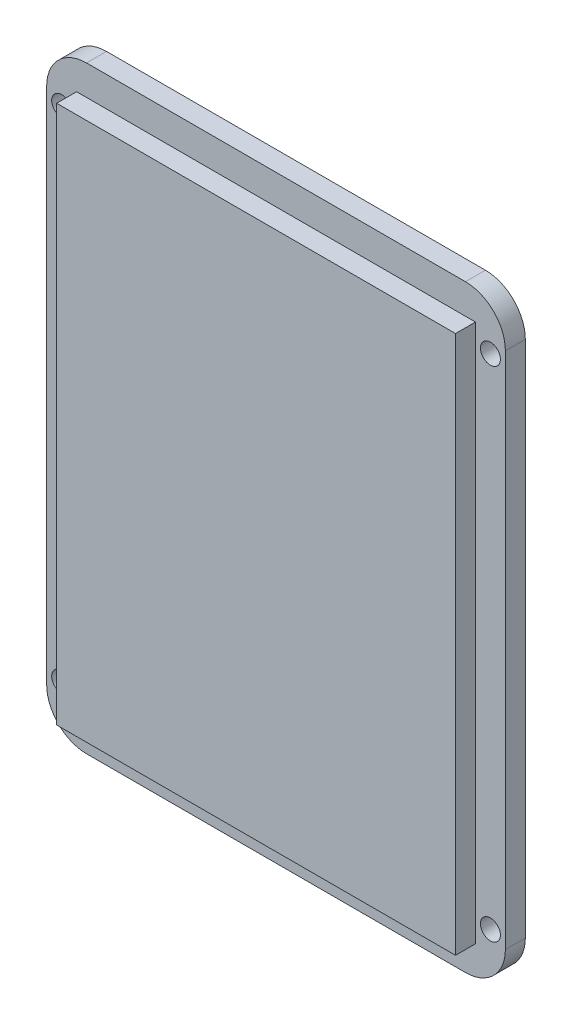
ISO-10303-21;
HEADER;
FILE_DESCRIPTION(('STEP AP214'),'2;1');
FILE_NAME('part.step','',(''),(''),'','','');
FILE_SCHEMA(('AUTOMOTIVE_DESIGN { 1 0 10303 214 1 1 1 1 }'));
ENDSEC;
DATA;
#1=APPLICATION_CONTEXT('core data for automotive mechanical design processes');
#2=APPLICATION_PROTOCOL_DEFINITION('international standard','automotive_design',2000,#1);
#3=PRODUCT_CONTEXT('',#1,'mechanical');
#4=PRODUCT('Part','Part','',(#3));
#5=PRODUCT_RELATED_PRODUCT_CATEGORY('part','',(#4));
#6=PRODUCT_DEFINITION_FORMATION('','',#4);
#7=PRODUCT_DEFINITION_CONTEXT('part definition',#1,'design');
#8=PRODUCT_DEFINITION('design','',#6,#7);
#9=PRODUCT_DEFINITION_SHAPE('','',#8);
#10=(LENGTH_UNIT() NAMED_UNIT(*) SI_UNIT(.MILLI.,.METRE.));
#11=(NAMED_UNIT(*) PLANE_ANGLE_UNIT() SI_UNIT($,.RADIAN.));
#12=(NAMED_UNIT(*) SI_UNIT($,.STERADIAN.) SOLID_ANGLE_UNIT());
#13=UNCERTAINTY_MEASURE_WITH_UNIT(LENGTH_MEASURE(1.E-05),#10,'distance_accuracy_value','');
#14=(GEOMETRIC_REPRESENTATION_CONTEXT(3) GLOBAL_UNCERTAINTY_ASSIGNED_CONTEXT((#13)) GLOBAL_UNIT_ASSIGNED_CONTEXT((#10,
#11,#12)) REPRESENTATION_CONTEXT('',''));
#15=CARTESIAN_POINT('',(0.,0.,0.));
#16=DIRECTION('',(0.,0.,1.));
#17=DIRECTION('',(1.,0.,0.));
#18=AXIS2_PLACEMENT_3D('',#15,#16,#17);
#19=CARTESIAN_POINT('',(43.,0.,4.));
#20=DIRECTION('',(1.,0.,0.));
#21=DIRECTION('',(0.,1.,0.));
#22=AXIS2_PLACEMENT_3D('',#19,#20,#21);
#23=PLANE('',#22);
#24=DIRECTION('',(0.,-1.,0.));
#25=VECTOR('',#24,1.);
#26=CARTESIAN_POINT('',(43.,0.,2.));
#27=LINE('',#26,#25);
#28=CARTESIAN_POINT('',(43.,57.,2.));
#29=VERTEX_POINT('',#28);
#30=CARTESIAN_POINT('',(43.,3.,2.));
#31=VERTEX_POINT('',#30);
#32=EDGE_CURVE('E130',#29,#31,#27,.T.);
#33=ORIENTED_EDGE('',*,*,#32,.F.);
#34=DIRECTION('',(0.,0.,-1.));
#35=VECTOR('',#34,1.);
#36=CARTESIAN_POINT('',(43.,57.,4.));
#37=LINE('',#36,#35);
#38=CARTESIAN_POINT('',(43.,57.,4.));
#39=VERTEX_POINT('',#38);
#40=EDGE_CURVE('E136',#39,#29,#37,.T.);
#41=ORIENTED_EDGE('',*,*,#40,.F.);
#42=DIRECTION('',(0.,-1.,0.));
#43=VECTOR('',#42,1.);
#44=CARTESIAN_POINT('',(43.,0.,4.));
#45=LINE('',#44,#43);
#46=CARTESIAN_POINT('',(43.,3.,4.));
#47=VERTEX_POINT('',#46);
#48=EDGE_CURVE('E214',#39,#47,#45,.T.);
#49=ORIENTED_EDGE('',*,*,#48,.T.);
#50=DIRECTION('',(0.,0.,-1.));
#51=VECTOR('',#50,1.);
#52=CARTESIAN_POINT('',(43.,3.,4.));
#53=LINE('',#52,#51);
#54=EDGE_CURVE('E151',#47,#31,#53,.T.);
#55=ORIENTED_EDGE('',*,*,#54,.T.);
#56=EDGE_LOOP('',(#33,#41,#49,#55));
#57=FACE_BOUND('',#56,.T.);
#58=ADVANCED_FACE('F35',(#57),#23,.T.);
#59=CARTESIAN_POINT('',(0.,57.,4.));
#60=DIRECTION('',(0.,1.,0.));
#61=DIRECTION('',(0.,0.,1.));
#62=AXIS2_PLACEMENT_3D('',#59,#60,#61);
#63=PLANE('',#62);
#64=DIRECTION('',(1.,0.,0.));
#65=VECTOR('',#64,1.);
#66=CARTESIAN_POINT('',(0.,57.,2.));
#67=LINE('',#66,#65);
#68=CARTESIAN_POINT('',(3.00000000000001,57.,2.));
#69=VERTEX_POINT('',#68);
#70=EDGE_CURVE('E146',#69,#29,#67,.T.);
#71=ORIENTED_EDGE('',*,*,#70,.F.);
#72=DIRECTION('',(0.,0.,-1.));
#73=VECTOR('',#72,1.);
#74=CARTESIAN_POINT('',(3.00000000000001,57.,4.));
#75=LINE('',#74,#73);
#76=CARTESIAN_POINT('',(3.00000000000001,57.,4.));
#77=VERTEX_POINT('',#76);
#78=EDGE_CURVE('E145',#77,#69,#75,.T.);
#79=ORIENTED_EDGE('',*,*,#78,.F.);
#80=DIRECTION('',(1.,0.,0.));
#81=VECTOR('',#80,1.);
#82=CARTESIAN_POINT('',(0.,57.,4.));
#83=LINE('',#82,#81);
#84=EDGE_CURVE('E217',#77,#39,#83,.T.);
#85=ORIENTED_EDGE('',*,*,#84,.T.);
#86=ORIENTED_EDGE('',*,*,#40,.T.);
#87=EDGE_LOOP('',(#71,#79,#85,#86));
#88=FACE_BOUND('',#87,.T.);
#89=ADVANCED_FACE('F227',(#88),#63,.T.);
#90=CARTESIAN_POINT('',(3.00000000000001,0.,4.));
#91=DIRECTION('',(1.,0.,0.));
#92=DIRECTION('',(0.,1.,0.));
#93=AXIS2_PLACEMENT_3D('',#90,#91,#92);
#94=PLANE('',#93);
#95=ORIENTED_EDGE('',*,*,#78,.T.);
#96=DIRECTION('',(0.,-1.,0.));
#97=VECTOR('',#96,1.);
#98=CARTESIAN_POINT('',(3.00000000000001,0.,2.));
#99=LINE('',#98,#97);
#100=CARTESIAN_POINT('',(3.00000000000001,3.,2.));
#101=VERTEX_POINT('',#100);
#102=EDGE_CURVE('E127',#69,#101,#99,.T.);
#103=ORIENTED_EDGE('',*,*,#102,.T.);
#104=DIRECTION('',(0.,0.,-1.));
#105=VECTOR('',#104,1.);
#106=CARTESIAN_POINT('',(3.00000000000001,3.,4.));
#107=LINE('',#106,#105);
#108=CARTESIAN_POINT('',(3.00000000000001,3.,4.));
#109=VERTEX_POINT('',#108);
#110=EDGE_CURVE('E143',#109,#101,#107,.T.);
#111=ORIENTED_EDGE('',*,*,#110,.F.);
#112=DIRECTION('',(0.,-1.,0.));
#113=VECTOR('',#112,1.);
#114=CARTESIAN_POINT('',(3.00000000000001,0.,4.));
#115=LINE('',#114,#113);
#116=EDGE_CURVE('E220',#77,#109,#115,.T.);
#117=ORIENTED_EDGE('',*,*,#116,.F.);
#118=EDGE_LOOP('',(#95,#103,#111,#117));
#119=FACE_BOUND('',#118,.T.);
#120=ADVANCED_FACE('F141',(#119),#94,.F.);
#121=CARTESIAN_POINT('',(0.,3.,4.));
#122=DIRECTION('',(0.,1.,0.));
#123=DIRECTION('',(0.,0.,1.));
#124=AXIS2_PLACEMENT_3D('',#121,#122,#123);
#125=PLANE('',#124);
#126=ORIENTED_EDGE('',*,*,#110,.T.);
#127=DIRECTION('',(1.,0.,0.));
#128=VECTOR('',#127,1.);
#129=CARTESIAN_POINT('',(0.,3.,2.));
#130=LINE('',#129,#128);
#131=EDGE_CURVE('E124',#101,#31,#130,.T.);
#132=ORIENTED_EDGE('',*,*,#131,.T.);
#133=ORIENTED_EDGE('',*,*,#54,.F.);
#134=DIRECTION('',(1.,0.,0.));
#135=VECTOR('',#134,1.);
#136=CARTESIAN_POINT('',(0.,3.,4.));
#137=LINE('',#136,#135);
#138=EDGE_CURVE('E150',#109,#47,#137,.T.);
#139=ORIENTED_EDGE('',*,*,#138,.F.);
#140=EDGE_LOOP('',(#126,#132,#133,#139));
#141=FACE_BOUND('',#140,.T.);
#142=ADVANCED_FACE('F149',(#141),#125,.F.);
#143=CARTESIAN_POINT('',(0.,0.,4.));
#144=DIRECTION('',(0.,0.,1.));
#145=DIRECTION('',(1.,0.,0.));
#146=AXIS2_PLACEMENT_3D('',#143,#144,#145);
#147=PLANE('',#146);
#148=ORIENTED_EDGE('',*,*,#48,.F.);
#149=ORIENTED_EDGE('',*,*,#84,.F.);
#150=ORIENTED_EDGE('',*,*,#116,.T.);
#151=ORIENTED_EDGE('',*,*,#138,.T.);
#152=EDGE_LOOP('',(#148,#149,#150,#151));
#153=FACE_BOUND('',#152,.T.);
#154=ADVANCED_FACE('F223',(#153),#147,.T.);
#155=CARTESIAN_POINT('',(0.,60.,2.));
#156=DIRECTION('',(1.,0.,0.));
#157=DIRECTION('',(0.,1.,0.));
#158=AXIS2_PLACEMENT_3D('',#155,#156,#157);
#159=PLANE('',#158);
#160=DIRECTION('',(0.,-1.,0.));
#161=VECTOR('',#160,1.);
#162=CARTESIAN_POINT('',(0.,60.,0.));
#163=LINE('',#162,#161);
#164=CARTESIAN_POINT('',(0.,56.,0.));
#165=VERTEX_POINT('',#164);
#166=CARTESIAN_POINT('',(0.,4.00000000000001,0.));
#167=VERTEX_POINT('',#166);
#168=EDGE_CURVE('E208',#165,#167,#163,.T.);
#169=ORIENTED_EDGE('',*,*,#168,.T.);
#170=DIRECTION('',(0.,0.,-1.));
#171=VECTOR('',#170,1.);
#172=CARTESIAN_POINT('',(0.,4.,2.));
#173=LINE('',#172,#171);
#174=CARTESIAN_POINT('',(0.,4.00000000000001,2.));
#175=VERTEX_POINT('',#174);
#176=EDGE_CURVE('E174',#167,#175,#173,.F.);
#177=ORIENTED_EDGE('',*,*,#176,.T.);
#178=DIRECTION('',(0.,-1.,0.));
#179=VECTOR('',#178,1.);
#180=CARTESIAN_POINT('',(0.,60.,2.));
#181=LINE('',#180,#179);
#182=CARTESIAN_POINT('',(0.,56.,2.));
#183=VERTEX_POINT('',#182);
#184=EDGE_CURVE('E206',#183,#175,#181,.T.);
#185=ORIENTED_EDGE('',*,*,#184,.F.);
#186=DIRECTION('',(0.,0.,-1.));
#187=VECTOR('',#186,1.);
#188=CARTESIAN_POINT('',(0.,56.,2.));
#189=LINE('',#188,#187);
#190=EDGE_CURVE('E171',#183,#165,#189,.T.);
#191=ORIENTED_EDGE('',*,*,#190,.T.);
#192=EDGE_LOOP('',(#169,#177,#185,#191));
#193=FACE_BOUND('',#192,.T.);
#194=ADVANCED_FACE('F260',(#193),#159,.F.);
#195=CARTESIAN_POINT('',(0.,0.,2.));
#196=DIRECTION('',(0.,1.,0.));
#197=DIRECTION('',(-1.,0.,0.));
#198=AXIS2_PLACEMENT_3D('',#195,#196,#197);
#199=PLANE('',#198);
#200=DIRECTION('',(1.,0.,0.));
#201=VECTOR('',#200,1.);
#202=CARTESIAN_POINT('',(0.,0.,2.));
#203=LINE('',#202,#201);
#204=CARTESIAN_POINT('',(4.00000000000001,0.,2.));
#205=VERTEX_POINT('',#204);
#206=CARTESIAN_POINT('',(42.,0.,2.));
#207=VERTEX_POINT('',#206);
#208=EDGE_CURVE('E264',#205,#207,#203,.T.);
#209=ORIENTED_EDGE('',*,*,#208,.F.);
#210=DIRECTION('',(0.,0.,-1.));
#211=VECTOR('',#210,1.);
#212=CARTESIAN_POINT('',(4.00000000000001,0.,2.));
#213=LINE('',#212,#211);
#214=CARTESIAN_POINT('',(4.00000000000001,0.,0.));
#215=VERTEX_POINT('',#214);
#216=EDGE_CURVE('E160',#205,#215,#213,.T.);
#217=ORIENTED_EDGE('',*,*,#216,.T.);
#218=DIRECTION('',(1.,0.,0.));
#219=VECTOR('',#218,1.);
#220=CARTESIAN_POINT('',(0.,0.,0.));
#221=LINE('',#220,#219);
#222=CARTESIAN_POINT('',(42.,0.,0.));
#223=VERTEX_POINT('',#222);
#224=EDGE_CURVE('E204',#215,#223,#221,.T.);
#225=ORIENTED_EDGE('',*,*,#224,.T.);
#226=DIRECTION('',(0.,0.,-1.));
#227=VECTOR('',#226,1.);
#228=CARTESIAN_POINT('',(42.,0.,2.));
#229=LINE('',#228,#227);
#230=EDGE_CURVE('E135',#223,#207,#229,.F.);
#231=ORIENTED_EDGE('',*,*,#230,.T.);
#232=EDGE_LOOP('',(#209,#217,#225,#231));
#233=FACE_BOUND('',#232,.T.);
#234=ADVANCED_FACE('F328',(#233),#199,.F.);
#235=CARTESIAN_POINT('',(46.,60.,2.));
#236=DIRECTION('',(-1.,0.,0.));
#237=DIRECTION('',(0.,-1.,0.));
#238=AXIS2_PLACEMENT_3D('',#235,#236,#237);
#239=PLANE('',#238);
#240=DIRECTION('',(0.,1.,0.));
#241=VECTOR('',#240,1.);
#242=CARTESIAN_POINT('',(46.,60.,2.));
#243=LINE('',#242,#241);
#244=CARTESIAN_POINT('',(46.,4.00000000000001,2.));
#245=VERTEX_POINT('',#244);
#246=CARTESIAN_POINT('',(46.,56.,2.));
#247=VERTEX_POINT('',#246);
#248=EDGE_CURVE('E195',#245,#247,#243,.T.);
#249=ORIENTED_EDGE('',*,*,#248,.F.);
#250=DIRECTION('',(0.,0.,-1.));
#251=VECTOR('',#250,1.);
#252=CARTESIAN_POINT('',(46.,4.,2.));
#253=LINE('',#252,#251);
#254=CARTESIAN_POINT('',(46.,4.00000000000001,0.));
#255=VERTEX_POINT('',#254);
#256=EDGE_CURVE('E185',#245,#255,#253,.T.);
#257=ORIENTED_EDGE('',*,*,#256,.T.);
#258=DIRECTION('',(0.,1.,0.));
#259=VECTOR('',#258,1.);
#260=CARTESIAN_POINT('',(46.,60.,0.));
#261=LINE('',#260,#259);
#262=CARTESIAN_POINT('',(46.,56.,0.));
#263=VERTEX_POINT('',#262);
#264=EDGE_CURVE('E193',#255,#263,#261,.T.);
#265=ORIENTED_EDGE('',*,*,#264,.T.);
#266=DIRECTION('',(0.,0.,-1.));
#267=VECTOR('',#266,1.);
#268=CARTESIAN_POINT('',(46.,56.,2.));
#269=LINE('',#268,#267);
#270=EDGE_CURVE('E183',#263,#247,#269,.F.);
#271=ORIENTED_EDGE('',*,*,#270,.T.);
#272=EDGE_LOOP('',(#249,#257,#265,#271));
#273=FACE_BOUND('',#272,.T.);
#274=ADVANCED_FACE('F192',(#273),#239,.F.);
#275=CARTESIAN_POINT('',(0.,60.,2.));
#276=DIRECTION('',(0.,-1.,0.));
#277=DIRECTION('',(0.,0.,-1.));
#278=AXIS2_PLACEMENT_3D('',#275,#276,#277);
#279=PLANE('',#278);
#280=DIRECTION('',(-1.,0.,0.));
#281=VECTOR('',#280,1.);
#282=CARTESIAN_POINT('',(0.,60.,2.));
#283=LINE('',#282,#281);
#284=CARTESIAN_POINT('',(42.,60.,2.));
#285=VERTEX_POINT('',#284);
#286=CARTESIAN_POINT('',(4.00000000000001,60.,2.));
#287=VERTEX_POINT('',#286);
#288=EDGE_CURVE('E147',#285,#287,#283,.T.);
#289=ORIENTED_EDGE('',*,*,#288,.F.);
#290=DIRECTION('',(0.,0.,-1.));
#291=VECTOR('',#290,1.);
#292=CARTESIAN_POINT('',(42.,60.,2.));
#293=LINE('',#292,#291);
#294=CARTESIAN_POINT('',(42.,60.,0.));
#295=VERTEX_POINT('',#294);
#296=EDGE_CURVE('E11',#285,#295,#293,.T.);
#297=ORIENTED_EDGE('',*,*,#296,.T.);
#298=DIRECTION('',(-1.,0.,0.));
#299=VECTOR('',#298,1.);
#300=CARTESIAN_POINT('',(0.,60.,0.));
#301=LINE('',#300,#299);
#302=CARTESIAN_POINT('',(4.00000000000001,60.,0.));
#303=VERTEX_POINT('',#302);
#304=EDGE_CURVE('E203',#295,#303,#301,.T.);
#305=ORIENTED_EDGE('',*,*,#304,.T.);
#306=DIRECTION('',(0.,0.,-1.));
#307=VECTOR('',#306,1.);
#308=CARTESIAN_POINT('',(4.00000000000001,60.,2.));
#309=LINE('',#308,#307);
#310=EDGE_CURVE('E43',#303,#287,#309,.F.);
#311=ORIENTED_EDGE('',*,*,#310,.T.);
#312=EDGE_LOOP('',(#289,#297,#305,#311));
#313=FACE_BOUND('',#312,.T.);
#314=ADVANCED_FACE('F253',(#313),#279,.F.);
#315=CARTESIAN_POINT('',(0.,0.,2.));
#316=DIRECTION('',(0.,0.,1.));
#317=DIRECTION('',(1.,0.,0.));
#318=AXIS2_PLACEMENT_3D('',#315,#316,#317);
#319=PLANE('',#318);
#320=CARTESIAN_POINT('',(1.5,5.,2.));
#321=DIRECTION('',(0.,0.,1.));
#322=DIRECTION('',(1.,0.,0.));
#323=AXIS2_PLACEMENT_3D('',#320,#321,#322);
#324=CIRCLE('',#323,1.);
#325=CARTESIAN_POINT('',(2.5,5.,2.));
#326=VERTEX_POINT('',#325);
#327=EDGE_CURVE('E278',#326,#326,#324,.F.);
#328=ORIENTED_EDGE('',*,*,#327,.T.);
#329=EDGE_LOOP('',(#328));
#330=FACE_BOUND('',#329,.T.);
#331=CARTESIAN_POINT('',(1.50000000000001,55.,2.));
#332=DIRECTION('',(0.,0.,1.));
#333=DIRECTION('',(1.,0.,0.));
#334=AXIS2_PLACEMENT_3D('',#331,#332,#333);
#335=CIRCLE('',#334,1.);
#336=CARTESIAN_POINT('',(2.50000000000001,55.,2.));
#337=VERTEX_POINT('',#336);
#338=EDGE_CURVE('E282',#337,#337,#335,.F.);
#339=ORIENTED_EDGE('',*,*,#338,.T.);
#340=EDGE_LOOP('',(#339));
#341=FACE_BOUND('',#340,.T.);
#342=CARTESIAN_POINT('',(44.5,55.,2.));
#343=DIRECTION('',(0.,0.,1.));
#344=DIRECTION('',(1.,0.,0.));
#345=AXIS2_PLACEMENT_3D('',#342,#343,#344);
#346=CIRCLE('',#345,0.999999999999998);
#347=CARTESIAN_POINT('',(45.5,55.,2.));
#348=VERTEX_POINT('',#347);
#349=EDGE_CURVE('E287',#348,#348,#346,.F.);
#350=ORIENTED_EDGE('',*,*,#349,.T.);
#351=EDGE_LOOP('',(#350));
#352=FACE_BOUND('',#351,.T.);
#353=CARTESIAN_POINT('',(44.5,5.,2.));
#354=DIRECTION('',(0.,0.,1.));
#355=DIRECTION('',(1.,0.,0.));
#356=AXIS2_PLACEMENT_3D('',#353,#354,#355);
#357=CIRCLE('',#356,0.999999999999998);
#358=CARTESIAN_POINT('',(45.5,5.,2.));
#359=VERTEX_POINT('',#358);
#360=EDGE_CURVE('E269',#359,#359,#357,.F.);
#361=ORIENTED_EDGE('',*,*,#360,.T.);
#362=EDGE_LOOP('',(#361));
#363=FACE_BOUND('',#362,.T.);
#364=ORIENTED_EDGE('',*,*,#70,.T.);
#365=ORIENTED_EDGE('',*,*,#32,.T.);
#366=ORIENTED_EDGE('',*,*,#131,.F.);
#367=ORIENTED_EDGE('',*,*,#102,.F.);
#368=EDGE_LOOP('',(#364,#365,#366,#367));
#369=FACE_BOUND('',#368,.T.);
#370=ORIENTED_EDGE('',*,*,#184,.T.);
#371=CARTESIAN_POINT('',(4.00000000000001,4.,2.));
#372=DIRECTION('',(0.,0.,1.));
#373=DIRECTION('',(1.,0.,0.));
#374=AXIS2_PLACEMENT_3D('',#371,#372,#373);
#375=CIRCLE('',#374,4.);
#376=EDGE_CURVE('E181',#175,#205,#375,.T.);
#377=ORIENTED_EDGE('',*,*,#376,.T.);
#378=ORIENTED_EDGE('',*,*,#208,.T.);
#379=CARTESIAN_POINT('',(42.,4.,2.));
#380=DIRECTION('',(0.,0.,1.));
#381=DIRECTION('',(1.,0.,0.));
#382=AXIS2_PLACEMENT_3D('',#379,#380,#381);
#383=CIRCLE('',#382,4.);
#384=EDGE_CURVE('E179',#207,#245,#383,.T.);
#385=ORIENTED_EDGE('',*,*,#384,.T.);
#386=ORIENTED_EDGE('',*,*,#248,.T.);
#387=CARTESIAN_POINT('',(42.,56.,2.));
#388=DIRECTION('',(0.,0.,1.));
#389=DIRECTION('',(1.,0.,0.));
#390=AXIS2_PLACEMENT_3D('',#387,#388,#389);
#391=CIRCLE('',#390,4.);
#392=EDGE_CURVE('E56',#247,#285,#391,.T.);
#393=ORIENTED_EDGE('',*,*,#392,.T.);
#394=ORIENTED_EDGE('',*,*,#288,.T.);
#395=CARTESIAN_POINT('',(4.00000000000001,56.,2.));
#396=DIRECTION('',(0.,0.,1.));
#397=DIRECTION('',(1.,0.,0.));
#398=AXIS2_PLACEMENT_3D('',#395,#396,#397);
#399=CIRCLE('',#398,4.);
#400=EDGE_CURVE('E176',#287,#183,#399,.T.);
#401=ORIENTED_EDGE('',*,*,#400,.T.);
#402=EDGE_LOOP('',(#370,#377,#378,#385,#386,#393,#394,#401));
#403=FACE_BOUND('',#402,.T.);
#404=ADVANCED_FACE('F126',(#330,#341,#352,#363,#369,#403),#319,.T.);
#405=CARTESIAN_POINT('',(0.,0.,0.));
#406=DIRECTION('',(0.,0.,1.));
#407=DIRECTION('',(1.,0.,0.));
#408=AXIS2_PLACEMENT_3D('',#405,#406,#407);
#409=PLANE('',#408);
#410=CARTESIAN_POINT('',(1.5,5.,0.));
#411=DIRECTION('',(0.,0.,1.));
#412=DIRECTION('',(1.,0.,0.));
#413=AXIS2_PLACEMENT_3D('',#410,#411,#412);
#414=CIRCLE('',#413,1.);
#415=CARTESIAN_POINT('',(2.5,5.,0.));
#416=VERTEX_POINT('',#415);
#417=EDGE_CURVE('E290',#416,#416,#414,.T.);
#418=ORIENTED_EDGE('',*,*,#417,.T.);
#419=EDGE_LOOP('',(#418));
#420=FACE_BOUND('',#419,.T.);
#421=CARTESIAN_POINT('',(1.50000000000001,55.,0.));
#422=DIRECTION('',(0.,0.,1.));
#423=DIRECTION('',(1.,0.,0.));
#424=AXIS2_PLACEMENT_3D('',#421,#422,#423);
#425=CIRCLE('',#424,1.);
#426=CARTESIAN_POINT('',(2.50000000000001,55.,0.));
#427=VERTEX_POINT('',#426);
#428=EDGE_CURVE('E294',#427,#427,#425,.T.);
#429=ORIENTED_EDGE('',*,*,#428,.T.);
#430=EDGE_LOOP('',(#429));
#431=FACE_BOUND('',#430,.T.);
#432=CARTESIAN_POINT('',(44.5,55.,0.));
#433=DIRECTION('',(0.,0.,1.));
#434=DIRECTION('',(1.,0.,0.));
#435=AXIS2_PLACEMENT_3D('',#432,#433,#434);
#436=CIRCLE('',#435,0.999999999999998);
#437=CARTESIAN_POINT('',(45.5,55.,0.));
#438=VERTEX_POINT('',#437);
#439=EDGE_CURVE('E291',#438,#438,#436,.T.);
#440=ORIENTED_EDGE('',*,*,#439,.T.);
#441=EDGE_LOOP('',(#440));
#442=FACE_BOUND('',#441,.T.);
#443=CARTESIAN_POINT('',(44.5,5.,0.));
#444=DIRECTION('',(0.,0.,1.));
#445=DIRECTION('',(1.,0.,0.));
#446=AXIS2_PLACEMENT_3D('',#443,#444,#445);
#447=CIRCLE('',#446,0.999999999999998);
#448=CARTESIAN_POINT('',(45.5,5.,0.));
#449=VERTEX_POINT('',#448);
#450=EDGE_CURVE('E274',#449,#449,#447,.T.);
#451=ORIENTED_EDGE('',*,*,#450,.T.);
#452=EDGE_LOOP('',(#451));
#453=FACE_BOUND('',#452,.T.);
#454=ORIENTED_EDGE('',*,*,#224,.F.);
#455=CARTESIAN_POINT('',(4.00000000000001,4.,0.));
#456=DIRECTION('',(0.,0.,1.));
#457=DIRECTION('',(1.,0.,0.));
#458=AXIS2_PLACEMENT_3D('',#455,#456,#457);
#459=CIRCLE('',#458,4.);
#460=EDGE_CURVE('E169',#215,#167,#459,.F.);
#461=ORIENTED_EDGE('',*,*,#460,.T.);
#462=ORIENTED_EDGE('',*,*,#168,.F.);
#463=CARTESIAN_POINT('',(4.00000000000001,56.,0.));
#464=DIRECTION('',(0.,0.,1.));
#465=DIRECTION('',(1.,0.,0.));
#466=AXIS2_PLACEMENT_3D('',#463,#464,#465);
#467=CIRCLE('',#466,4.);
#468=EDGE_CURVE('E163',#165,#303,#467,.F.);
#469=ORIENTED_EDGE('',*,*,#468,.T.);
#470=ORIENTED_EDGE('',*,*,#304,.F.);
#471=CARTESIAN_POINT('',(42.,56.,0.));
#472=DIRECTION('',(0.,0.,1.));
#473=DIRECTION('',(1.,0.,0.));
#474=AXIS2_PLACEMENT_3D('',#471,#472,#473);
#475=CIRCLE('',#474,4.);
#476=EDGE_CURVE('E165',#295,#263,#475,.F.);
#477=ORIENTED_EDGE('',*,*,#476,.T.);
#478=ORIENTED_EDGE('',*,*,#264,.F.);
#479=CARTESIAN_POINT('',(42.,4.,0.));
#480=DIRECTION('',(0.,0.,1.));
#481=DIRECTION('',(1.,0.,0.));
#482=AXIS2_PLACEMENT_3D('',#479,#480,#481);
#483=CIRCLE('',#482,4.);
#484=EDGE_CURVE('E167',#255,#223,#483,.F.);
#485=ORIENTED_EDGE('',*,*,#484,.T.);
#486=EDGE_LOOP('',(#454,#461,#462,#469,#470,#477,#478,#485));
#487=FACE_BOUND('',#486,.T.);
#488=ADVANCED_FACE('F200',(#420,#431,#442,#453,#487),#409,.F.);
#489=CARTESIAN_POINT('',(4.00000000000001,4.,2.));
#490=DIRECTION('',(0.,0.,-1.));
#491=DIRECTION('',(-1.,0.,0.));
#492=AXIS2_PLACEMENT_3D('',#489,#490,#491);
#493=CYLINDRICAL_SURFACE('',#492,4.);
#494=ORIENTED_EDGE('',*,*,#376,.F.);
#495=ORIENTED_EDGE('',*,*,#176,.F.);
#496=ORIENTED_EDGE('',*,*,#460,.F.);
#497=ORIENTED_EDGE('',*,*,#216,.F.);
#498=EDGE_LOOP('',(#494,#495,#496,#497));
#499=FACE_BOUND('',#498,.T.);
#500=ADVANCED_FACE('F238',(#499),#493,.T.);
#501=CARTESIAN_POINT('',(42.,4.,2.));
#502=DIRECTION('',(0.,0.,-1.));
#503=DIRECTION('',(-1.,0.,0.));
#504=AXIS2_PLACEMENT_3D('',#501,#502,#503);
#505=CYLINDRICAL_SURFACE('',#504,4.);
#506=ORIENTED_EDGE('',*,*,#384,.F.);
#507=ORIENTED_EDGE('',*,*,#230,.F.);
#508=ORIENTED_EDGE('',*,*,#484,.F.);
#509=ORIENTED_EDGE('',*,*,#256,.F.);
#510=EDGE_LOOP('',(#506,#507,#508,#509));
#511=FACE_BOUND('',#510,.T.);
#512=ADVANCED_FACE('F241',(#511),#505,.T.);
#513=CARTESIAN_POINT('',(42.,56.,2.));
#514=DIRECTION('',(0.,0.,-1.));
#515=DIRECTION('',(-1.,0.,0.));
#516=AXIS2_PLACEMENT_3D('',#513,#514,#515);
#517=CYLINDRICAL_SURFACE('',#516,4.);
#518=ORIENTED_EDGE('',*,*,#392,.F.);
#519=ORIENTED_EDGE('',*,*,#270,.F.);
#520=ORIENTED_EDGE('',*,*,#476,.F.);
#521=ORIENTED_EDGE('',*,*,#296,.F.);
#522=EDGE_LOOP('',(#518,#519,#520,#521));
#523=FACE_BOUND('',#522,.T.);
#524=ADVANCED_FACE('F244',(#523),#517,.T.);
#525=CARTESIAN_POINT('',(4.00000000000001,56.,2.));
#526=DIRECTION('',(0.,0.,-1.));
#527=DIRECTION('',(-1.,0.,0.));
#528=AXIS2_PLACEMENT_3D('',#525,#526,#527);
#529=CYLINDRICAL_SURFACE('',#528,4.);
#530=ORIENTED_EDGE('',*,*,#400,.F.);
#531=ORIENTED_EDGE('',*,*,#310,.F.);
#532=ORIENTED_EDGE('',*,*,#468,.F.);
#533=ORIENTED_EDGE('',*,*,#190,.F.);
#534=EDGE_LOOP('',(#530,#531,#532,#533));
#535=FACE_BOUND('',#534,.T.);
#536=ADVANCED_FACE('F37',(#535),#529,.T.);
#537=CARTESIAN_POINT('',(44.5,5.,4.));
#538=DIRECTION('',(0.,0.,-1.));
#539=DIRECTION('',(-1.,0.,0.));
#540=AXIS2_PLACEMENT_3D('',#537,#538,#539);
#541=CYLINDRICAL_SURFACE('',#540,0.999999999999998);
#542=ORIENTED_EDGE('',*,*,#360,.F.);
#543=EDGE_LOOP('',(#542));
#544=FACE_BOUND('',#543,.T.);
#545=ORIENTED_EDGE('',*,*,#450,.F.);
#546=EDGE_LOOP('',(#545));
#547=FACE_BOUND('',#546,.T.);
#548=ADVANCED_FACE('F250',(#544,#547),#541,.F.);
#549=CARTESIAN_POINT('',(44.5,55.,4.));
#550=DIRECTION('',(0.,0.,-1.));
#551=DIRECTION('',(-1.,0.,0.));
#552=AXIS2_PLACEMENT_3D('',#549,#550,#551);
#553=CYLINDRICAL_SURFACE('',#552,0.999999999999998);
#554=ORIENTED_EDGE('',*,*,#349,.F.);
#555=EDGE_LOOP('',(#554));
#556=FACE_BOUND('',#555,.T.);
#557=ORIENTED_EDGE('',*,*,#439,.F.);
#558=EDGE_LOOP('',(#557));
#559=FACE_BOUND('',#558,.T.);
#560=ADVANCED_FACE('F310',(#556,#559),#553,.F.);
#561=CARTESIAN_POINT('',(1.50000000000001,55.,4.));
#562=DIRECTION('',(0.,0.,-1.));
#563=DIRECTION('',(-1.,0.,0.));
#564=AXIS2_PLACEMENT_3D('',#561,#562,#563);
#565=CYLINDRICAL_SURFACE('',#564,1.);
#566=ORIENTED_EDGE('',*,*,#338,.F.);
#567=EDGE_LOOP('',(#566));
#568=FACE_BOUND('',#567,.T.);
#569=ORIENTED_EDGE('',*,*,#428,.F.);
#570=EDGE_LOOP('',(#569));
#571=FACE_BOUND('',#570,.T.);
#572=ADVANCED_FACE('F304',(#568,#571),#565,.F.);
#573=CARTESIAN_POINT('',(1.5,5.,4.));
#574=DIRECTION('',(0.,0.,-1.));
#575=DIRECTION('',(-1.,0.,0.));
#576=AXIS2_PLACEMENT_3D('',#573,#574,#575);
#577=CYLINDRICAL_SURFACE('',#576,1.);
#578=ORIENTED_EDGE('',*,*,#327,.F.);
#579=EDGE_LOOP('',(#578));
#580=FACE_BOUND('',#579,.T.);
#581=ORIENTED_EDGE('',*,*,#417,.F.);
#582=EDGE_LOOP('',(#581));
#583=FACE_BOUND('',#582,.T.);
#584=ADVANCED_FACE('F302',(#580,#583),#577,.F.);
#585=CLOSED_SHELL('',(#58,#89,#120,#142,#154,#194,#234,#274,#314,#404,#488,#500,#512,#524,#536,
#548,#560,#572,#584));
#586=MANIFOLD_SOLID_BREP('B2',#585);
#587=ADVANCED_BREP_SHAPE_REPRESENTATION('',(#18,#586),#14);
#588=SHAPE_DEFINITION_REPRESENTATION(#9,#587);
ENDSEC;
END-ISO-10303-21;
